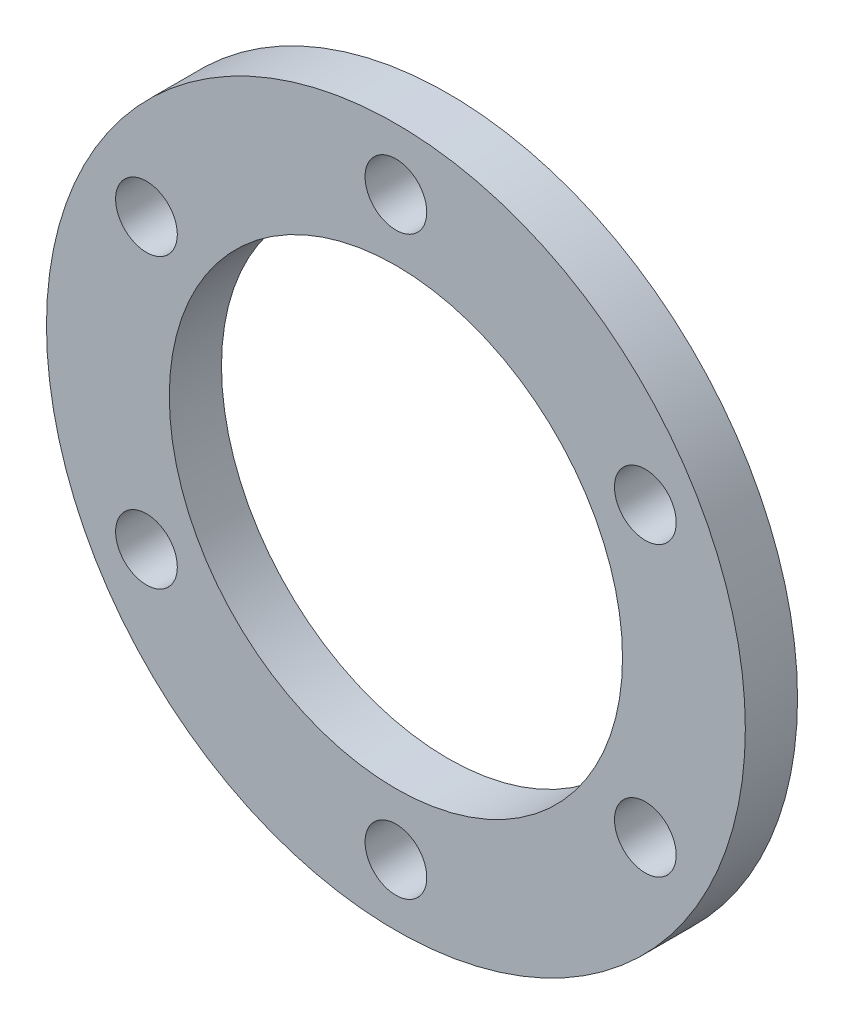
ISO-10303-21;
HEADER;
FILE_DESCRIPTION(('STEP AP214'),'2;1');
FILE_NAME('part.step','',(''),(''),'','','');
FILE_SCHEMA(('AUTOMOTIVE_DESIGN { 1 0 10303 214 1 1 1 1 }'));
ENDSEC;
DATA;
#1=APPLICATION_CONTEXT('core data for automotive mechanical design processes');
#2=APPLICATION_PROTOCOL_DEFINITION('international standard','automotive_design',2000,#1);
#3=PRODUCT_CONTEXT('',#1,'mechanical');
#4=PRODUCT('Part','Part','',(#3));
#5=PRODUCT_RELATED_PRODUCT_CATEGORY('part','',(#4));
#6=PRODUCT_DEFINITION_FORMATION('','',#4);
#7=PRODUCT_DEFINITION_CONTEXT('part definition',#1,'design');
#8=PRODUCT_DEFINITION('design','',#6,#7);
#9=PRODUCT_DEFINITION_SHAPE('','',#8);
#10=(LENGTH_UNIT() NAMED_UNIT(*) SI_UNIT(.MILLI.,.METRE.));
#11=(NAMED_UNIT(*) PLANE_ANGLE_UNIT() SI_UNIT($,.RADIAN.));
#12=(NAMED_UNIT(*) SI_UNIT($,.STERADIAN.) SOLID_ANGLE_UNIT());
#13=UNCERTAINTY_MEASURE_WITH_UNIT(LENGTH_MEASURE(1.E-05),#10,'distance_accuracy_value','');
#14=(GEOMETRIC_REPRESENTATION_CONTEXT(3) GLOBAL_UNCERTAINTY_ASSIGNED_CONTEXT((#13)) GLOBAL_UNIT_ASSIGNED_CONTEXT((#10,
#11,#12)) REPRESENTATION_CONTEXT('',''));
#15=CARTESIAN_POINT('',(0.,0.,0.));
#16=DIRECTION('',(0.,0.,1.));
#17=DIRECTION('',(1.,0.,0.));
#18=AXIS2_PLACEMENT_3D('',#15,#16,#17);
#19=CARTESIAN_POINT('',(0.,0.,-4.318));
#20=DIRECTION('',(0.,0.,-1.));
#21=DIRECTION('',(1.,0.,0.));
#22=AXIS2_PLACEMENT_3D('',#19,#20,#21);
#23=PLANE('',#22);
#24=CARTESIAN_POINT('',(-20.6332284502443,11.9125999999988,-4.318));
#25=DIRECTION('',(0.,0.,1.));
#26=DIRECTION('',(1.,0.,0.));
#27=AXIS2_PLACEMENT_3D('',#24,#25,#26);
#28=CIRCLE('',#27,2.55270000000128);
#29=CARTESIAN_POINT('',(-18.0805284502431,11.9125999999988,-4.318));
#30=VERTEX_POINT('',#29);
#31=EDGE_CURVE('E75',#30,#30,#28,.T.);
#32=ORIENTED_EDGE('',*,*,#31,.T.);
#33=EDGE_LOOP('',(#32));
#34=FACE_BOUND('',#33,.T.);
#35=CARTESIAN_POINT('',(2.70277615510124E-12,-23.8252,-4.318));
#36=DIRECTION('',(0.,0.,1.));
#37=DIRECTION('',(1.,0.,0.));
#38=AXIS2_PLACEMENT_3D('',#35,#36,#37);
#39=CIRCLE('',#38,2.55270000000275);
#40=CARTESIAN_POINT('',(2.55270000000545,-23.8252,-4.318));
#41=VERTEX_POINT('',#40);
#42=EDGE_CURVE('E63',#41,#41,#39,.T.);
#43=ORIENTED_EDGE('',*,*,#42,.T.);
#44=EDGE_LOOP('',(#43));
#45=FACE_BOUND('',#44,.T.);
#46=CARTESIAN_POINT('',(20.6332284502457,11.9126000000012,-4.318));
#47=DIRECTION('',(0.,0.,1.));
#48=DIRECTION('',(1.,0.,0.));
#49=AXIS2_PLACEMENT_3D('',#46,#47,#48);
#50=CIRCLE('',#49,2.55270000000036);
#51=CARTESIAN_POINT('',(23.185928450246,11.9126000000012,-4.318));
#52=VERTEX_POINT('',#51);
#53=EDGE_CURVE('E51',#52,#52,#50,.T.);
#54=ORIENTED_EDGE('',*,*,#53,.T.);
#55=EDGE_LOOP('',(#54));
#56=FACE_BOUND('',#55,.T.);
#57=CARTESIAN_POINT('',(0.,0.,-4.318));
#58=DIRECTION('',(0.,0.,1.));
#59=DIRECTION('',(1.,0.,0.));
#60=AXIS2_PLACEMENT_3D('',#57,#58,#59);
#61=CIRCLE('',#60,28.9052);
#62=CARTESIAN_POINT('',(28.9052,0.,-4.318));
#63=VERTEX_POINT('',#62);
#64=EDGE_CURVE('E10',#63,#63,#61,.T.);
#65=ORIENTED_EDGE('',*,*,#64,.F.);
#66=EDGE_LOOP('',(#65));
#67=FACE_BOUND('',#66,.T.);
#68=CARTESIAN_POINT('',(0.,23.8252,-4.318));
#69=DIRECTION('',(0.,0.,1.));
#70=DIRECTION('',(1.,0.,0.));
#71=AXIS2_PLACEMENT_3D('',#68,#69,#70);
#72=CIRCLE('',#71,2.5527);
#73=CARTESIAN_POINT('',(2.5527,23.8252,-4.318));
#74=VERTEX_POINT('',#73);
#75=EDGE_CURVE('E46',#74,#74,#72,.T.);
#76=ORIENTED_EDGE('',*,*,#75,.T.);
#77=EDGE_LOOP('',(#76));
#78=FACE_BOUND('',#77,.T.);
#79=CARTESIAN_POINT('',(20.633228450247,-11.9125999999988,-4.318));
#80=DIRECTION('',(0.,0.,1.));
#81=DIRECTION('',(1.,0.,0.));
#82=AXIS2_PLACEMENT_3D('',#79,#80,#81);
#83=CIRCLE('',#82,2.55270000000171);
#84=CARTESIAN_POINT('',(23.1859284502487,-11.9125999999988,-4.318));
#85=VERTEX_POINT('',#84);
#86=EDGE_CURVE('E57',#85,#85,#83,.T.);
#87=ORIENTED_EDGE('',*,*,#86,.T.);
#88=EDGE_LOOP('',(#87));
#89=FACE_BOUND('',#88,.T.);
#90=CARTESIAN_POINT('',(-20.633228450243,-11.9126000000012,-4.318));
#91=DIRECTION('',(0.,0.,1.));
#92=DIRECTION('',(1.,0.,0.));
#93=AXIS2_PLACEMENT_3D('',#90,#91,#92);
#94=CIRCLE('',#93,2.55270000000251);
#95=CARTESIAN_POINT('',(-18.0805284502405,-11.9126000000012,-4.318));
#96=VERTEX_POINT('',#95);
#97=EDGE_CURVE('E69',#96,#96,#94,.T.);
#98=ORIENTED_EDGE('',*,*,#97,.T.);
#99=EDGE_LOOP('',(#98));
#100=FACE_BOUND('',#99,.T.);
#101=CARTESIAN_POINT('',(0.,0.,-4.318));
#102=DIRECTION('',(0.,0.,1.));
#103=DIRECTION('',(1.,0.,0.));
#104=AXIS2_PLACEMENT_3D('',#101,#102,#103);
#105=CIRCLE('',#104,18.7452);
#106=CARTESIAN_POINT('',(18.7452,0.,-4.318));
#107=VERTEX_POINT('',#106);
#108=EDGE_CURVE('E81',#107,#107,#105,.T.);
#109=ORIENTED_EDGE('',*,*,#108,.T.);
#110=EDGE_LOOP('',(#109));
#111=FACE_BOUND('',#110,.T.);
#112=ADVANCED_FACE('F35',(#34,#45,#56,#67,#78,#89,#100,#111),#23,.T.);
#113=CARTESIAN_POINT('',(0.,0.,0.));
#114=DIRECTION('',(0.,0.,-1.));
#115=DIRECTION('',(1.,0.,0.));
#116=AXIS2_PLACEMENT_3D('',#113,#114,#115);
#117=PLANE('',#116);
#118=CARTESIAN_POINT('',(0.,0.,0.));
#119=DIRECTION('',(0.,0.,1.));
#120=DIRECTION('',(1.,0.,0.));
#121=AXIS2_PLACEMENT_3D('',#118,#119,#120);
#122=CIRCLE('',#121,28.9052);
#123=CARTESIAN_POINT('',(28.9052,0.,0.));
#124=VERTEX_POINT('',#123);
#125=EDGE_CURVE('E39',#124,#124,#122,.T.);
#126=ORIENTED_EDGE('',*,*,#125,.T.);
#127=EDGE_LOOP('',(#126));
#128=FACE_BOUND('',#127,.T.);
#129=CARTESIAN_POINT('',(0.,23.8252,0.));
#130=DIRECTION('',(0.,0.,1.));
#131=DIRECTION('',(1.,0.,0.));
#132=AXIS2_PLACEMENT_3D('',#129,#130,#131);
#133=CIRCLE('',#132,2.5527);
#134=CARTESIAN_POINT('',(2.5527,23.8252,0.));
#135=VERTEX_POINT('',#134);
#136=EDGE_CURVE('E48',#135,#135,#133,.T.);
#137=ORIENTED_EDGE('',*,*,#136,.F.);
#138=EDGE_LOOP('',(#137));
#139=FACE_BOUND('',#138,.T.);
#140=CARTESIAN_POINT('',(20.6332284502457,11.9126000000012,0.));
#141=DIRECTION('',(0.,0.,1.));
#142=DIRECTION('',(1.,0.,0.));
#143=AXIS2_PLACEMENT_3D('',#140,#141,#142);
#144=CIRCLE('',#143,2.55270000000036);
#145=CARTESIAN_POINT('',(23.185928450246,11.9126000000012,0.));
#146=VERTEX_POINT('',#145);
#147=EDGE_CURVE('E54',#146,#146,#144,.T.);
#148=ORIENTED_EDGE('',*,*,#147,.F.);
#149=EDGE_LOOP('',(#148));
#150=FACE_BOUND('',#149,.T.);
#151=CARTESIAN_POINT('',(20.633228450247,-11.9125999999988,0.));
#152=DIRECTION('',(0.,0.,1.));
#153=DIRECTION('',(1.,0.,0.));
#154=AXIS2_PLACEMENT_3D('',#151,#152,#153);
#155=CIRCLE('',#154,2.55270000000171);
#156=CARTESIAN_POINT('',(23.1859284502487,-11.9125999999988,0.));
#157=VERTEX_POINT('',#156);
#158=EDGE_CURVE('E60',#157,#157,#155,.T.);
#159=ORIENTED_EDGE('',*,*,#158,.F.);
#160=EDGE_LOOP('',(#159));
#161=FACE_BOUND('',#160,.T.);
#162=CARTESIAN_POINT('',(2.70277615510124E-12,-23.8252,0.));
#163=DIRECTION('',(0.,0.,1.));
#164=DIRECTION('',(1.,0.,0.));
#165=AXIS2_PLACEMENT_3D('',#162,#163,#164);
#166=CIRCLE('',#165,2.55270000000275);
#167=CARTESIAN_POINT('',(2.55270000000545,-23.8252,0.));
#168=VERTEX_POINT('',#167);
#169=EDGE_CURVE('E66',#168,#168,#166,.T.);
#170=ORIENTED_EDGE('',*,*,#169,.F.);
#171=EDGE_LOOP('',(#170));
#172=FACE_BOUND('',#171,.T.);
#173=CARTESIAN_POINT('',(-20.633228450243,-11.9126000000012,0.));
#174=DIRECTION('',(0.,0.,1.));
#175=DIRECTION('',(1.,0.,0.));
#176=AXIS2_PLACEMENT_3D('',#173,#174,#175);
#177=CIRCLE('',#176,2.55270000000251);
#178=CARTESIAN_POINT('',(-18.0805284502405,-11.9126000000012,0.));
#179=VERTEX_POINT('',#178);
#180=EDGE_CURVE('E72',#179,#179,#177,.T.);
#181=ORIENTED_EDGE('',*,*,#180,.F.);
#182=EDGE_LOOP('',(#181));
#183=FACE_BOUND('',#182,.T.);
#184=CARTESIAN_POINT('',(-20.6332284502443,11.9125999999988,0.));
#185=DIRECTION('',(0.,0.,1.));
#186=DIRECTION('',(1.,0.,0.));
#187=AXIS2_PLACEMENT_3D('',#184,#185,#186);
#188=CIRCLE('',#187,2.55270000000128);
#189=CARTESIAN_POINT('',(-18.0805284502431,11.9125999999988,0.));
#190=VERTEX_POINT('',#189);
#191=EDGE_CURVE('E78',#190,#190,#188,.T.);
#192=ORIENTED_EDGE('',*,*,#191,.F.);
#193=EDGE_LOOP('',(#192));
#194=FACE_BOUND('',#193,.T.);
#195=CARTESIAN_POINT('',(0.,0.,0.));
#196=DIRECTION('',(0.,0.,1.));
#197=DIRECTION('',(1.,0.,0.));
#198=AXIS2_PLACEMENT_3D('',#195,#196,#197);
#199=CIRCLE('',#198,18.7452);
#200=CARTESIAN_POINT('',(18.7452,0.,0.));
#201=VERTEX_POINT('',#200);
#202=EDGE_CURVE('E84',#201,#201,#199,.T.);
#203=ORIENTED_EDGE('',*,*,#202,.F.);
#204=EDGE_LOOP('',(#203));
#205=FACE_BOUND('',#204,.T.);
#206=ADVANCED_FACE('F98',(#128,#139,#150,#161,#172,#183,#194,#205),#117,.F.);
#207=CARTESIAN_POINT('',(0.,0.,-4.318));
#208=DIRECTION('',(0.,0.,1.));
#209=DIRECTION('',(-1.,0.,0.));
#210=AXIS2_PLACEMENT_3D('',#207,#208,#209);
#211=CYLINDRICAL_SURFACE('',#210,28.9052);
#212=ORIENTED_EDGE('',*,*,#64,.T.);
#213=EDGE_LOOP('',(#212));
#214=FACE_BOUND('',#213,.T.);
#215=ORIENTED_EDGE('',*,*,#125,.F.);
#216=EDGE_LOOP('',(#215));
#217=FACE_BOUND('',#216,.T.);
#218=ADVANCED_FACE('F37',(#214,#217),#211,.T.);
#219=CARTESIAN_POINT('',(0.,23.8252,-4.318));
#220=DIRECTION('',(0.,0.,1.));
#221=DIRECTION('',(-1.,0.,0.));
#222=AXIS2_PLACEMENT_3D('',#219,#220,#221);
#223=CYLINDRICAL_SURFACE('',#222,2.5527);
#224=ORIENTED_EDGE('',*,*,#75,.F.);
#225=EDGE_LOOP('',(#224));
#226=FACE_BOUND('',#225,.T.);
#227=ORIENTED_EDGE('',*,*,#136,.T.);
#228=EDGE_LOOP('',(#227));
#229=FACE_BOUND('',#228,.T.);
#230=ADVANCED_FACE('F105',(#226,#229),#223,.F.);
#231=CARTESIAN_POINT('',(20.6332284502457,11.9126000000012,-4.318));
#232=DIRECTION('',(0.,0.,1.));
#233=DIRECTION('',(-1.,0.,0.));
#234=AXIS2_PLACEMENT_3D('',#231,#232,#233);
#235=CYLINDRICAL_SURFACE('',#234,2.55270000000036);
#236=ORIENTED_EDGE('',*,*,#53,.F.);
#237=EDGE_LOOP('',(#236));
#238=FACE_BOUND('',#237,.T.);
#239=ORIENTED_EDGE('',*,*,#147,.T.);
#240=EDGE_LOOP('',(#239));
#241=FACE_BOUND('',#240,.T.);
#242=ADVANCED_FACE('F112',(#238,#241),#235,.F.);
#243=CARTESIAN_POINT('',(20.633228450247,-11.9125999999988,-4.318));
#244=DIRECTION('',(0.,0.,1.));
#245=DIRECTION('',(-1.,0.,0.));
#246=AXIS2_PLACEMENT_3D('',#243,#244,#245);
#247=CYLINDRICAL_SURFACE('',#246,2.55270000000171);
#248=ORIENTED_EDGE('',*,*,#86,.F.);
#249=EDGE_LOOP('',(#248));
#250=FACE_BOUND('',#249,.T.);
#251=ORIENTED_EDGE('',*,*,#158,.T.);
#252=EDGE_LOOP('',(#251));
#253=FACE_BOUND('',#252,.T.);
#254=ADVANCED_FACE('F116',(#250,#253),#247,.F.);
#255=CARTESIAN_POINT('',(2.70277615510124E-12,-23.8252,-4.318));
#256=DIRECTION('',(0.,0.,1.));
#257=DIRECTION('',(-1.,0.,0.));
#258=AXIS2_PLACEMENT_3D('',#255,#256,#257);
#259=CYLINDRICAL_SURFACE('',#258,2.55270000000275);
#260=ORIENTED_EDGE('',*,*,#42,.F.);
#261=EDGE_LOOP('',(#260));
#262=FACE_BOUND('',#261,.T.);
#263=ORIENTED_EDGE('',*,*,#169,.T.);
#264=EDGE_LOOP('',(#263));
#265=FACE_BOUND('',#264,.T.);
#266=ADVANCED_FACE('F120',(#262,#265),#259,.F.);
#267=CARTESIAN_POINT('',(-20.633228450243,-11.9126000000012,-4.318));
#268=DIRECTION('',(0.,0.,1.));
#269=DIRECTION('',(-1.,0.,0.));
#270=AXIS2_PLACEMENT_3D('',#267,#268,#269);
#271=CYLINDRICAL_SURFACE('',#270,2.55270000000251);
#272=ORIENTED_EDGE('',*,*,#97,.F.);
#273=EDGE_LOOP('',(#272));
#274=FACE_BOUND('',#273,.T.);
#275=ORIENTED_EDGE('',*,*,#180,.T.);
#276=EDGE_LOOP('',(#275));
#277=FACE_BOUND('',#276,.T.);
#278=ADVANCED_FACE('F124',(#274,#277),#271,.F.);
#279=CARTESIAN_POINT('',(-20.6332284502443,11.9125999999988,-4.318));
#280=DIRECTION('',(0.,0.,1.));
#281=DIRECTION('',(-1.,0.,0.));
#282=AXIS2_PLACEMENT_3D('',#279,#280,#281);
#283=CYLINDRICAL_SURFACE('',#282,2.55270000000128);
#284=ORIENTED_EDGE('',*,*,#31,.F.);
#285=EDGE_LOOP('',(#284));
#286=FACE_BOUND('',#285,.T.);
#287=ORIENTED_EDGE('',*,*,#191,.T.);
#288=EDGE_LOOP('',(#287));
#289=FACE_BOUND('',#288,.T.);
#290=ADVANCED_FACE('F94',(#286,#289),#283,.F.);
#291=CARTESIAN_POINT('',(0.,0.,-4.318));
#292=DIRECTION('',(0.,0.,1.));
#293=DIRECTION('',(-1.,0.,0.));
#294=AXIS2_PLACEMENT_3D('',#291,#292,#293);
#295=CYLINDRICAL_SURFACE('',#294,18.7452);
#296=ORIENTED_EDGE('',*,*,#108,.F.);
#297=EDGE_LOOP('',(#296));
#298=FACE_BOUND('',#297,.T.);
#299=ORIENTED_EDGE('',*,*,#202,.T.);
#300=EDGE_LOOP('',(#299));
#301=FACE_BOUND('',#300,.T.);
#302=ADVANCED_FACE('F91',(#298,#301),#295,.F.);
#303=CLOSED_SHELL('',(#112,#206,#218,#230,#242,#254,#266,#278,#290,#302));
#304=MANIFOLD_SOLID_BREP('B2',#303);
#305=ADVANCED_BREP_SHAPE_REPRESENTATION('',(#18,#304),#14);
#306=SHAPE_DEFINITION_REPRESENTATION(#9,#305);
ENDSEC;
END-ISO-10303-21;
